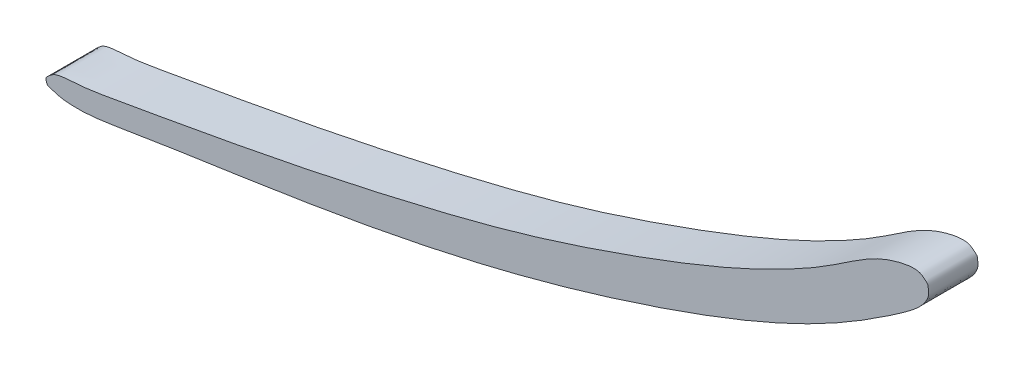
ISO-10303-21;
HEADER;
FILE_DESCRIPTION(('STEP AP214'),'2;1');
FILE_NAME('part.step','',(''),(''),'','','');
FILE_SCHEMA(('AUTOMOTIVE_DESIGN { 1 0 10303 214 1 1 1 1 }'));
ENDSEC;
DATA;
#1=APPLICATION_CONTEXT('core data for automotive mechanical design processes');
#2=APPLICATION_PROTOCOL_DEFINITION('international standard','automotive_design',2000,#1);
#3=PRODUCT_CONTEXT('',#1,'mechanical');
#4=PRODUCT('Part','Part','',(#3));
#5=PRODUCT_RELATED_PRODUCT_CATEGORY('part','',(#4));
#6=PRODUCT_DEFINITION_FORMATION('','',#4);
#7=PRODUCT_DEFINITION_CONTEXT('part definition',#1,'design');
#8=PRODUCT_DEFINITION('design','',#6,#7);
#9=PRODUCT_DEFINITION_SHAPE('','',#8);
#10=(LENGTH_UNIT() NAMED_UNIT(*) SI_UNIT(.MILLI.,.METRE.));
#11=(NAMED_UNIT(*) PLANE_ANGLE_UNIT() SI_UNIT($,.RADIAN.));
#12=(NAMED_UNIT(*) SI_UNIT($,.STERADIAN.) SOLID_ANGLE_UNIT());
#13=UNCERTAINTY_MEASURE_WITH_UNIT(LENGTH_MEASURE(1.E-05),#10,'distance_accuracy_value','');
#14=(GEOMETRIC_REPRESENTATION_CONTEXT(3) GLOBAL_UNCERTAINTY_ASSIGNED_CONTEXT((#13)) GLOBAL_UNIT_ASSIGNED_CONTEXT((#10,
#11,#12)) REPRESENTATION_CONTEXT('',''));
#15=CARTESIAN_POINT('',(0.,0.,0.));
#16=DIRECTION('',(0.,0.,1.));
#17=DIRECTION('',(1.,0.,0.));
#18=AXIS2_PLACEMENT_3D('',#15,#16,#17);
#19=CARTESIAN_POINT('',(86.4107444189341,0.,292.));
#20=CARTESIAN_POINT('',(86.3702532639553,0.0931639279632339,292.));
#21=CARTESIAN_POINT('',(86.2986742180564,0.165042757350682,292.));
#22=CARTESIAN_POINT('',(86.150263807262,0.299652843871098,292.));
#23=CARTESIAN_POINT('',(86.0721127918665,0.362289524879843,292.));
#24=CARTESIAN_POINT('',(85.8412535119041,0.554451420526711,292.));
#25=CARTESIAN_POINT('',(85.6879544774455,0.685078756353185,292.));
#26=CARTESIAN_POINT('',(85.4403423634798,0.851590056552038,292.));
#27=CARTESIAN_POINT('',(85.3553804178565,0.902725484310937,292.));
#28=CARTESIAN_POINT('',(85.1765416331934,0.98893443719411,292.));
#29=CARTESIAN_POINT('',(85.0821754288369,1.02451638831159,292.));
#30=CARTESIAN_POINT('',(84.7924109516979,1.1096489731102,292.));
#31=CARTESIAN_POINT('',(84.5954378283956,1.13700525967428,292.));
#32=CARTESIAN_POINT('',(84.1977311034757,1.16260034300273,292.));
#33=CARTESIAN_POINT('',(83.9963778476064,1.16003315475247,292.));
#34=CARTESIAN_POINT('',(83.5987657154226,1.13957823577692,292.));
#35=CARTESIAN_POINT('',(83.4013471428192,1.12138370308504,292.));
#36=CARTESIAN_POINT('',(82.812789178891,1.0455673741112,292.));
#37=CARTESIAN_POINT('',(82.425085209681,0.968219172119219,292.));
#38=CARTESIAN_POINT('',(81.2684800296784,0.698812534714772,292.));
#39=CARTESIAN_POINT('',(80.5059501899581,0.463102513101255,292.));
#40=CARTESIAN_POINT('',(79.0297396895748,-0.0848578038750889,292.));
#41=CARTESIAN_POINT('',(78.3122091962927,-0.40063135579093,292.));
#42=CARTESIAN_POINT('',(76.2194011136764,-1.469389705887,292.));
#43=CARTESIAN_POINT('',(74.8993095395057,-2.3346344447235,292.));
#44=CARTESIAN_POINT('',(72.9308206118549,-3.65554633961775,292.));
#45=CARTESIAN_POINT('',(72.2759715088938,-4.098467738459,292.));
#46=CARTESIAN_POINT('',(70.9583083420647,-4.96844312754678,292.));
#47=CARTESIAN_POINT('',(70.2962832955493,-5.39706895987371,292.));
#48=CARTESIAN_POINT('',(68.2924543116962,-6.64757810978621,292.));
#49=CARTESIAN_POINT('',(66.9330165198068,-7.43433211807032,292.));
#50=CARTESIAN_POINT('',(64.1832884281137,-8.94637726558434,292.));
#51=CARTESIAN_POINT('',(62.7932059270421,-9.67208237136404,292.));
#52=CARTESIAN_POINT('',(59.990344977923,-11.0782788187487,292.));
#53=CARTESIAN_POINT('',(58.5771396728232,-11.7579197964482,292.));
#54=CARTESIAN_POINT('',(55.7268465832102,-13.0696242353307,292.));
#55=CARTESIAN_POINT('',(54.290164534828,-13.702495984344,292.));
#56=CARTESIAN_POINT('',(49.9538051932856,-15.5486913584524,292.));
#57=CARTESIAN_POINT('',(47.0281714477081,-16.711582043735,292.));
#58=CARTESIAN_POINT('',(41.1368648194963,-18.9522599759708,292.));
#59=CARTESIAN_POINT('',(38.1739703002721,-20.0268609784272,292.));
#60=CARTESIAN_POINT('',(32.2217436946284,-22.0984764931995,292.));
#61=CARTESIAN_POINT('',(29.2334436960078,-23.0968250708102,292.));
#62=CARTESIAN_POINT('',(23.2249201854569,-24.9953964794069,292.));
#63=CARTESIAN_POINT('',(20.2025046610923,-25.8920102163012,292.));
#64=CARTESIAN_POINT('',(14.1297241561944,-27.5754543141849,292.));
#65=CARTESIAN_POINT('',(11.0792400947335,-28.3636141086769,292.));
#66=CARTESIAN_POINT('',(4.95995926084155,-29.8703378854986,292.));
#67=CARTESIAN_POINT('',(1.89200893679663,-30.5919156084504,292.));
#68=CARTESIAN_POINT('',(-7.32357334078639,-32.6994149725366,292.));
#69=CARTESIAN_POINT('',(-13.487645066907,-34.0177879855509,292.));
#70=CARTESIAN_POINT('',(-25.8563619788372,-36.4442766078583,292.));
#71=CARTESIAN_POINT('',(-32.0596265014079,-37.5616578123007,292.));
#72=CARTESIAN_POINT('',(-39.8147753669953,-38.9493711491002,292.));
#73=CARTESIAN_POINT('',(-41.3658998866885,-39.2263933247647,292.));
#74=CARTESIAN_POINT('',(-43.6937970457526,-39.6350723224386,292.));
#75=CARTESIAN_POINT('',(-44.4699855977368,-39.7700391254469,292.));
#76=CARTESIAN_POINT('',(-46.0226995065078,-40.0379802791488,292.));
#77=CARTESIAN_POINT('',(-46.7989119832862,-40.1727942478609,292.));
#78=CARTESIAN_POINT('',(-48.3533641703772,-40.4305881557898,292.));
#79=CARTESIAN_POINT('',(-49.1317526660192,-40.5509468665665,292.));
#80=CARTESIAN_POINT('',(-50.3030158950445,-40.696212451465,292.));
#81=CARTESIAN_POINT('',(-50.6940432594774,-40.7390631781832,292.));
#82=CARTESIAN_POINT('',(-51.4774549557931,-40.8122955614729,292.));
#83=CARTESIAN_POINT('',(-51.8699609720171,-40.8415590699366,292.));
#84=CARTESIAN_POINT('',(-52.6559976304479,-40.8906708770489,292.));
#85=CARTESIAN_POINT('',(-53.0494855443209,-40.9126406611681,292.));
#86=CARTESIAN_POINT('',(-53.8322100211136,-40.9873790592953,292.));
#87=CARTESIAN_POINT('',(-54.2217212253297,-41.0363307402594,292.));
#88=CARTESIAN_POINT('',(-54.7962231928123,-41.1708598179911,292.));
#89=CARTESIAN_POINT('',(-54.9870281791859,-41.227266921747,292.));
#90=CARTESIAN_POINT('',(-55.3493681625506,-41.3716643047603,292.));
#91=CARTESIAN_POINT('',(-55.5215376541844,-41.4608720694314,292.));
#92=CARTESIAN_POINT('',(-55.8455984629091,-41.6776091311992,292.));
#93=CARTESIAN_POINT('',(-55.9995655864539,-41.8026921773461,292.));
#94=CARTESIAN_POINT('',(-56.2202295690443,-42.0006102359653,292.));
#95=CARTESIAN_POINT('',(-56.2938304579014,-42.0667713536032,292.));
#96=CARTESIAN_POINT('',(-56.4359399266764,-42.2035535503382,292.));
#97=CARTESIAN_POINT('',(-56.5057204161146,-42.2730574313685,292.));
#98=CARTESIAN_POINT('',(-56.586954790011,-42.3977799421487,292.));
#99=CARTESIAN_POINT('',(-56.6094490137321,-42.4438907890319,292.));
#100=CARTESIAN_POINT('',(-56.635227269451,-42.5401279686211,292.));
#101=CARTESIAN_POINT('',(-56.6395803649666,-42.5911574410146,292.));
#102=CARTESIAN_POINT('',(-56.63575192864,-42.7407029572521,292.));
#103=CARTESIAN_POINT('',(-56.612469661033,-42.8395328748982,292.));
#104=CARTESIAN_POINT('',(-56.5593281773153,-43.0318155736835,292.));
#105=CARTESIAN_POINT('',(-56.5289648863514,-43.1267151747893,292.));
#106=CARTESIAN_POINT('',(-56.4627148204797,-43.2622853474174,292.));
#107=CARTESIAN_POINT('',(-56.4365990727626,-43.3058314843502,292.));
#108=CARTESIAN_POINT('',(-56.3729311797595,-43.3831559858466,292.));
#109=CARTESIAN_POINT('',(-56.3349447944782,-43.4178529450406,292.));
#110=CARTESIAN_POINT('',(-56.2097090124595,-43.4999266668938,292.));
#111=CARTESIAN_POINT('',(-56.110214515792,-43.5275003781271,292.));
#112=CARTESIAN_POINT('',(-55.9153865290601,-43.5771913070677,292.));
#113=CARTESIAN_POINT('',(-55.8176885576536,-43.6010302412377,292.));
#114=CARTESIAN_POINT('',(-55.5269567386336,-43.6809192417738,292.));
#115=CARTESIAN_POINT('',(-55.3353312570157,-43.7424806460408,292.));
#116=CARTESIAN_POINT('',(-54.9509949913189,-43.8620994098829,292.));
#117=CARTESIAN_POINT('',(-54.7582413233292,-43.9188855085011,292.));
#118=CARTESIAN_POINT('',(-54.3688909351758,-44.0126149419963,292.));
#119=CARTESIAN_POINT('',(-54.1724938761363,-44.0505891836464,292.));
#120=CARTESIAN_POINT('',(-53.5798986977005,-44.146936088428,292.));
#121=CARTESIAN_POINT('',(-53.1800032447165,-44.1865656476914,292.));
#122=CARTESIAN_POINT('',(-51.9736835953004,-44.2691044311154,292.));
#123=CARTESIAN_POINT('',(-51.171770711006,-44.2668073136291,292.));
#124=CARTESIAN_POINT('',(-49.5712906902499,-44.1788347046207,292.));
#125=CARTESIAN_POINT('',(-48.772290681742,-44.0952298089752,292.));
#126=CARTESIAN_POINT('',(-47.1771303077654,-43.8961763260337,292.));
#127=CARTESIAN_POINT('',(-46.3818998036307,-43.7792310717353,292.));
#128=CARTESIAN_POINT('',(-44.7931829368681,-43.5340383462042,292.));
#129=CARTESIAN_POINT('',(-43.9996613907252,-43.4061836625423,292.));
#130=CARTESIAN_POINT('',(-41.6195852592183,-43.0195502301193,292.));
#131=CARTESIAN_POINT('',(-40.0329566510122,-42.7612365808829,292.));
#132=CARTESIAN_POINT('',(-35.2686378484196,-42.0141488727108,292.));
#133=CARTESIAN_POINT('',(-32.0875060248464,-41.5481047975922,292.));
#134=CARTESIAN_POINT('',(-25.7256528473695,-40.6141482356322,292.));
#135=CARTESIAN_POINT('',(-22.5449398745817,-40.1457845403477,292.));
#136=CARTESIAN_POINT('',(-13.0132014796091,-38.6739466261302,292.));
#137=CARTESIAN_POINT('',(-6.67177366310591,-37.6013258759664,292.));
#138=CARTESIAN_POINT('',(2.79507521139751,-35.7629798300183,292.));
#139=CARTESIAN_POINT('',(5.94406469069156,-35.1123898378093,292.));
#140=CARTESIAN_POINT('',(12.2227754789635,-33.7261697545921,292.));
#141=CARTESIAN_POINT('',(15.3519741121725,-32.9913442173967,292.));
#142=CARTESIAN_POINT('',(24.7027981395963,-30.6358394499247,292.));
#143=CARTESIAN_POINT('',(30.8883243258608,-28.8675091985814,292.));
#144=CARTESIAN_POINT('',(40.0765439679939,-25.9396719989839,292.));
#145=CARTESIAN_POINT('',(43.1266871304444,-24.91943867694,292.));
#146=CARTESIAN_POINT('',(49.1888257332316,-22.7795792235543,292.));
#147=CARTESIAN_POINT('',(52.2017339004957,-21.6606572944945,292.));
#148=CARTESIAN_POINT('',(58.1751824532794,-19.2815440122042,292.));
#149=CARTESIAN_POINT('',(61.1347189920993,-18.0202823701102,292.));
#150=CARTESIAN_POINT('',(66.9529022072111,-15.287010876409,292.));
#151=CARTESIAN_POINT('',(69.8133060857934,-13.8096371790513,292.));
#152=CARTESIAN_POINT('',(75.390864884769,-10.6085314312731,292.));
#153=CARTESIAN_POINT('',(78.1110592362288,-8.88591947899353,292.));
#154=CARTESIAN_POINT('',(81.4297027961348,-6.6158699950117,292.));
#155=CARTESIAN_POINT('',(82.0897915995956,-6.1561083942127,292.));
#156=CARTESIAN_POINT('',(83.0648845631149,-5.44626674858139,292.));
#157=CARTESIAN_POINT('',(83.3867754658633,-5.20543845534977,292.));
#158=CARTESIAN_POINT('',(84.0194036811324,-4.70881226904128,292.));
#159=CARTESIAN_POINT('',(84.3307645237014,-4.45382524607169,292.));
#160=CARTESIAN_POINT('',(84.9273604117586,-3.91873217393002,292.));
#161=CARTESIAN_POINT('',(85.2128554915371,-3.6382683254879,292.));
#162=CARTESIAN_POINT('',(85.7395551437795,-3.03265419696669,292.));
#163=CARTESIAN_POINT('',(85.980484547917,-2.70339798275978,292.));
#164=CARTESIAN_POINT('',(86.2715461910316,-2.1754726599166,292.));
#165=CARTESIAN_POINT('',(86.3582571295032,-1.99332703094194,292.));
#166=CARTESIAN_POINT('',(86.493223987058,-1.60967796356801,292.));
#167=CARTESIAN_POINT('',(86.5403948740077,-1.4139000872235,292.));
#168=CARTESIAN_POINT('',(86.5607026948125,-1.00793542464248,292.));
#169=CARTESIAN_POINT('',(86.5283160815541,-0.804135017034041,292.));
#170=CARTESIAN_POINT('',(86.4845290700614,-0.501448802039711,292.));
#171=CARTESIAN_POINT('',(86.4742665986386,-0.400107023332174,292.));
#172=CARTESIAN_POINT('',(86.4564845928508,-0.197140909088372,292.));
#173=CARTESIAN_POINT('',(86.4512355739129,-0.093163927963233,292.));
#174=CARTESIAN_POINT('',(86.4107444189341,0.,292.));
#175=B_SPLINE_CURVE_WITH_KNOTS('',3,(#19,#20,#21,#22,#23,#24,#25,#26,#27,#28,#29,#30,#31,#32,
#33,#34,#35,#36,#37,#38,#39,#40,#41,#42,#43,#44,#45,#46,#47,#48,#49,#50,#51,#52,#53,#54,#55,#56,
#57,#58,#59,#60,#61,#62,#63,#64,#65,#66,#67,#68,#69,#70,#71,#72,#73,#74,#75,#76,#77,#78,#79,#80,
#81,#82,#83,#84,#85,#86,#87,#88,#89,#90,#91,#92,#93,#94,#95,#96,#97,#98,#99,#100,#101,#102,#103,
#104,#105,#106,#107,#108,#109,#110,#111,#112,#113,#114,#115,#116,#117,#118,#119,#120,#121,#122,
#123,#124,#125,#126,#127,#128,#129,#130,#131,#132,#133,#134,#135,#136,#137,#138,#139,#140,#141,
#142,#143,#144,#145,#146,#147,#148,#149,#150,#151,#152,#153,#154,#155,#156,#157,#158,#159,#160,
#161,#162,#163,#164,#165,#166,#167,#168,#169,#170,#171,#172,#173,#174),.UNSPECIFIED.,.T.,.F.,(4,
2,2,2,2,2,2,2,2,2,2,2,2,2,2,2,2,2,2,2,2,2,2,2,2,2,2,2,2,2,2,2,2,2,2,2,2,2,2,2,2,2,2,2,2,2,2,2,2,
2,2,2,2,2,2,2,2,2,2,2,2,2,2,2,2,2,2,2,2,2,2,2,2,2,2,2,2,4),(0.,0.000976562499999972,
0.00195312499999994,0.00390624999999999,0.00488281250000001,0.00585937500000004,
0.00781250000000021,0.00976562500000039,0.0117187500000006,0.0156250000000009,
0.0234375000000016,0.0312500000000023,0.0468750000000037,0.0546875000000044,0.062500000000005,
0.0781250000000062,0.0937500000000074,0.109375000000009,0.12500000000001,0.156250000000012,
0.187500000000014,0.218750000000016,0.250000000000019,0.281250000000021,0.312500000000023,
0.375000000000028,0.437500000000032,0.453125000000033,0.460937500000034,0.468750000000035,
0.476562500000035,0.480468750000035,0.484375000000036,0.488281250000036,0.492187500000036,
0.494140625000036,0.496093750000037,0.498046875000037,0.499023437500037,0.500000000000037,
0.500488281250037,0.500976562500037,0.501953125000037,0.502929687500037,0.503417968750037,
0.503906250000037,0.504882812500037,0.505859375000037,0.507812500000036,0.509765625000036,
0.511718750000036,0.515625000000036,0.523437500000035,0.531250000000035,0.539062500000034,
0.546875000000034,0.562500000000032,0.59375000000003,0.625000000000028,0.687500000000023,
0.718750000000021,0.750000000000019,0.812500000000014,0.843750000000012,0.87500000000001,
0.906250000000007,0.937500000000005,0.968750000000003,0.976562500000002,0.980468750000002,
0.984375000000001,0.988281250000001,0.992187500000001,0.994140625000001,0.99609375,0.998046875,
0.9990234375,1.),.UNSPECIFIED.);
#176=DIRECTION('',(0.,0.,-1.));
#177=VECTOR('',#176,1.);
#178=SURFACE_OF_LINEAR_EXTRUSION('',#175,#177);
#179=CARTESIAN_POINT('',(86.4107444189341,0.,292.));
#180=CARTESIAN_POINT('',(86.4512355739129,-0.093163927963233,292.));
#181=CARTESIAN_POINT('',(86.4564845928508,-0.197140909088372,292.));
#182=CARTESIAN_POINT('',(86.4742665986386,-0.400107023332174,292.));
#183=CARTESIAN_POINT('',(86.4845290700614,-0.501448802039711,292.));
#184=CARTESIAN_POINT('',(86.5283160815541,-0.804135017034041,292.));
#185=CARTESIAN_POINT('',(86.5607026948125,-1.00793542464248,292.));
#186=CARTESIAN_POINT('',(86.5403948740077,-1.4139000872235,292.));
#187=CARTESIAN_POINT('',(86.493223987058,-1.60967796356801,292.));
#188=CARTESIAN_POINT('',(86.3582571295032,-1.99332703094194,292.));
#189=CARTESIAN_POINT('',(86.2715461910316,-2.1754726599166,292.));
#190=CARTESIAN_POINT('',(85.980484547917,-2.70339798275978,292.));
#191=CARTESIAN_POINT('',(85.7395551437795,-3.03265419696669,292.));
#192=CARTESIAN_POINT('',(85.2128554915371,-3.6382683254879,292.));
#193=CARTESIAN_POINT('',(84.9273604117586,-3.91873217393002,292.));
#194=CARTESIAN_POINT('',(84.3307645237014,-4.45382524607169,292.));
#195=CARTESIAN_POINT('',(84.0194036811324,-4.70881226904128,292.));
#196=CARTESIAN_POINT('',(83.3867754658633,-5.20543845534977,292.));
#197=CARTESIAN_POINT('',(83.0648845631149,-5.44626674858139,292.));
#198=CARTESIAN_POINT('',(82.0897915995956,-6.1561083942127,292.));
#199=CARTESIAN_POINT('',(81.4297027961348,-6.6158699950117,292.));
#200=CARTESIAN_POINT('',(78.1110592362288,-8.88591947899353,292.));
#201=CARTESIAN_POINT('',(75.390864884769,-10.6085314312731,292.));
#202=CARTESIAN_POINT('',(69.8133060857934,-13.8096371790513,292.));
#203=CARTESIAN_POINT('',(66.9529022072111,-15.287010876409,292.));
#204=CARTESIAN_POINT('',(61.1347189920993,-18.0202823701102,292.));
#205=CARTESIAN_POINT('',(58.1751824532794,-19.2815440122042,292.));
#206=CARTESIAN_POINT('',(52.2017339004957,-21.6606572944945,292.));
#207=CARTESIAN_POINT('',(49.1888257332316,-22.7795792235543,292.));
#208=CARTESIAN_POINT('',(43.1266871304444,-24.91943867694,292.));
#209=CARTESIAN_POINT('',(40.0765439679939,-25.9396719989839,292.));
#210=CARTESIAN_POINT('',(30.8883243258608,-28.8675091985814,292.));
#211=CARTESIAN_POINT('',(24.7027981395963,-30.6358394499247,292.));
#212=CARTESIAN_POINT('',(15.3519741121725,-32.9913442173967,292.));
#213=CARTESIAN_POINT('',(12.2227754789635,-33.7261697545921,292.));
#214=CARTESIAN_POINT('',(5.94406469069156,-35.1123898378093,292.));
#215=CARTESIAN_POINT('',(2.79507521139751,-35.7629798300183,292.));
#216=CARTESIAN_POINT('',(-6.67177366310591,-37.6013258759664,292.));
#217=CARTESIAN_POINT('',(-13.0132014796091,-38.6739466261302,292.));
#218=CARTESIAN_POINT('',(-22.5449398745817,-40.1457845403477,292.));
#219=CARTESIAN_POINT('',(-25.7256528473695,-40.6141482356322,292.));
#220=CARTESIAN_POINT('',(-32.0875060248464,-41.5481047975922,292.));
#221=CARTESIAN_POINT('',(-35.2686378484196,-42.0141488727108,292.));
#222=CARTESIAN_POINT('',(-40.0329566510122,-42.7612365808829,292.));
#223=CARTESIAN_POINT('',(-41.6195852592183,-43.0195502301193,292.));
#224=CARTESIAN_POINT('',(-43.9996613907252,-43.4061836625423,292.));
#225=CARTESIAN_POINT('',(-44.7931829368681,-43.5340383462042,292.));
#226=CARTESIAN_POINT('',(-46.3818998036307,-43.7792310717353,292.));
#227=CARTESIAN_POINT('',(-47.1771303077654,-43.8961763260337,292.));
#228=CARTESIAN_POINT('',(-48.772290681742,-44.0952298089752,292.));
#229=CARTESIAN_POINT('',(-49.5712906902499,-44.1788347046207,292.));
#230=CARTESIAN_POINT('',(-51.171770711006,-44.2668073136291,292.));
#231=CARTESIAN_POINT('',(-51.9736835953004,-44.2691044311154,292.));
#232=CARTESIAN_POINT('',(-53.1800032447165,-44.1865656476914,292.));
#233=CARTESIAN_POINT('',(-53.5798986977005,-44.146936088428,292.));
#234=CARTESIAN_POINT('',(-54.1724938761363,-44.0505891836464,292.));
#235=CARTESIAN_POINT('',(-54.3688909351758,-44.0126149419963,292.));
#236=CARTESIAN_POINT('',(-54.7582413233292,-43.9188855085011,292.));
#237=CARTESIAN_POINT('',(-54.9509949913189,-43.8620994098829,292.));
#238=CARTESIAN_POINT('',(-55.3353312570157,-43.7424806460408,292.));
#239=CARTESIAN_POINT('',(-55.5269567386336,-43.6809192417738,292.));
#240=CARTESIAN_POINT('',(-55.8176885576536,-43.6010302412377,292.));
#241=CARTESIAN_POINT('',(-55.9153865290601,-43.5771913070677,292.));
#242=CARTESIAN_POINT('',(-56.110214515792,-43.5275003781271,292.));
#243=CARTESIAN_POINT('',(-56.2097090124595,-43.4999266668938,292.));
#244=CARTESIAN_POINT('',(-56.3349447944782,-43.4178529450406,292.));
#245=CARTESIAN_POINT('',(-56.3729311797595,-43.3831559858466,292.));
#246=CARTESIAN_POINT('',(-56.4365990727626,-43.3058314843502,292.));
#247=CARTESIAN_POINT('',(-56.4627148204797,-43.2622853474174,292.));
#248=CARTESIAN_POINT('',(-56.5289648863514,-43.1267151747893,292.));
#249=CARTESIAN_POINT('',(-56.5593281773153,-43.0318155736835,292.));
#250=CARTESIAN_POINT('',(-56.612469661033,-42.8395328748982,292.));
#251=CARTESIAN_POINT('',(-56.63575192864,-42.7407029572521,292.));
#252=CARTESIAN_POINT('',(-56.6395803649666,-42.5911574410146,292.));
#253=CARTESIAN_POINT('',(-56.635227269451,-42.5401279686211,292.));
#254=CARTESIAN_POINT('',(-56.6094490137321,-42.4438907890319,292.));
#255=CARTESIAN_POINT('',(-56.586954790011,-42.3977799421487,292.));
#256=CARTESIAN_POINT('',(-56.5057204161146,-42.2730574313685,292.));
#257=CARTESIAN_POINT('',(-56.4359399266764,-42.2035535503382,292.));
#258=CARTESIAN_POINT('',(-56.2938304579014,-42.0667713536032,292.));
#259=CARTESIAN_POINT('',(-56.2202295690443,-42.0006102359653,292.));
#260=CARTESIAN_POINT('',(-55.9995655864539,-41.8026921773461,292.));
#261=CARTESIAN_POINT('',(-55.8455984629091,-41.6776091311992,292.));
#262=CARTESIAN_POINT('',(-55.5215376541844,-41.4608720694314,292.));
#263=CARTESIAN_POINT('',(-55.3493681625506,-41.3716643047603,292.));
#264=CARTESIAN_POINT('',(-54.9870281791859,-41.227266921747,292.));
#265=CARTESIAN_POINT('',(-54.7962231928123,-41.1708598179911,292.));
#266=CARTESIAN_POINT('',(-54.2217212253297,-41.0363307402594,292.));
#267=CARTESIAN_POINT('',(-53.8322100211136,-40.9873790592953,292.));
#268=CARTESIAN_POINT('',(-53.0494855443209,-40.9126406611681,292.));
#269=CARTESIAN_POINT('',(-52.6559976304479,-40.8906708770489,292.));
#270=CARTESIAN_POINT('',(-51.8699609720171,-40.8415590699366,292.));
#271=CARTESIAN_POINT('',(-51.4774549557931,-40.8122955614729,292.));
#272=CARTESIAN_POINT('',(-50.6940432594774,-40.7390631781832,292.));
#273=CARTESIAN_POINT('',(-50.3030158950445,-40.696212451465,292.));
#274=CARTESIAN_POINT('',(-49.1317526660192,-40.5509468665665,292.));
#275=CARTESIAN_POINT('',(-48.3533641703772,-40.4305881557898,292.));
#276=CARTESIAN_POINT('',(-46.7989119832862,-40.1727942478609,292.));
#277=CARTESIAN_POINT('',(-46.0226995065078,-40.0379802791488,292.));
#278=CARTESIAN_POINT('',(-44.4699855977368,-39.7700391254469,292.));
#279=CARTESIAN_POINT('',(-43.6937970457526,-39.6350723224386,292.));
#280=CARTESIAN_POINT('',(-41.3658998866885,-39.2263933247647,292.));
#281=CARTESIAN_POINT('',(-39.8147753669953,-38.9493711491002,292.));
#282=CARTESIAN_POINT('',(-32.0596265014079,-37.5616578123007,292.));
#283=CARTESIAN_POINT('',(-25.8563619788372,-36.4442766078583,292.));
#284=CARTESIAN_POINT('',(-13.487645066907,-34.0177879855509,292.));
#285=CARTESIAN_POINT('',(-7.32357334078639,-32.6994149725366,292.));
#286=CARTESIAN_POINT('',(1.89200893679663,-30.5919156084504,292.));
#287=CARTESIAN_POINT('',(4.95995926084155,-29.8703378854986,292.));
#288=CARTESIAN_POINT('',(11.0792400947335,-28.3636141086769,292.));
#289=CARTESIAN_POINT('',(14.1297241561944,-27.5754543141849,292.));
#290=CARTESIAN_POINT('',(20.2025046610923,-25.8920102163012,292.));
#291=CARTESIAN_POINT('',(23.2249201854569,-24.9953964794069,292.));
#292=CARTESIAN_POINT('',(29.2334436960078,-23.0968250708102,292.));
#293=CARTESIAN_POINT('',(32.2217436946284,-22.0984764931995,292.));
#294=CARTESIAN_POINT('',(38.1739703002721,-20.0268609784272,292.));
#295=CARTESIAN_POINT('',(41.1368648194963,-18.9522599759708,292.));
#296=CARTESIAN_POINT('',(47.0281714477081,-16.711582043735,292.));
#297=CARTESIAN_POINT('',(49.9538051932856,-15.5486913584524,292.));
#298=CARTESIAN_POINT('',(54.290164534828,-13.702495984344,292.));
#299=CARTESIAN_POINT('',(55.7268465832102,-13.0696242353307,292.));
#300=CARTESIAN_POINT('',(58.5771396728232,-11.7579197964482,292.));
#301=CARTESIAN_POINT('',(59.990344977923,-11.0782788187487,292.));
#302=CARTESIAN_POINT('',(62.7932059270421,-9.67208237136404,292.));
#303=CARTESIAN_POINT('',(64.1832884281137,-8.94637726558434,292.));
#304=CARTESIAN_POINT('',(66.9330165198068,-7.43433211807032,292.));
#305=CARTESIAN_POINT('',(68.2924543116962,-6.64757810978621,292.));
#306=CARTESIAN_POINT('',(70.2962832955493,-5.39706895987371,292.));
#307=CARTESIAN_POINT('',(70.9583083420647,-4.96844312754678,292.));
#308=CARTESIAN_POINT('',(72.2759715088938,-4.098467738459,292.));
#309=CARTESIAN_POINT('',(72.9308206118549,-3.65554633961775,292.));
#310=CARTESIAN_POINT('',(74.8993095395057,-2.3346344447235,292.));
#311=CARTESIAN_POINT('',(76.2194011136764,-1.469389705887,292.));
#312=CARTESIAN_POINT('',(78.3122091962927,-0.40063135579093,292.));
#313=CARTESIAN_POINT('',(79.0297396895748,-0.0848578038750889,292.));
#314=CARTESIAN_POINT('',(80.5059501899581,0.463102513101255,292.));
#315=CARTESIAN_POINT('',(81.2684800296784,0.698812534714772,292.));
#316=CARTESIAN_POINT('',(82.425085209681,0.968219172119219,292.));
#317=CARTESIAN_POINT('',(82.812789178891,1.0455673741112,292.));
#318=CARTESIAN_POINT('',(83.4013471428192,1.12138370308504,292.));
#319=CARTESIAN_POINT('',(83.5987657154226,1.13957823577692,292.));
#320=CARTESIAN_POINT('',(83.9963778476064,1.16003315475247,292.));
#321=CARTESIAN_POINT('',(84.1977311034757,1.16260034300273,292.));
#322=CARTESIAN_POINT('',(84.5954378283956,1.13700525967428,292.));
#323=CARTESIAN_POINT('',(84.7924109516979,1.1096489731102,292.));
#324=CARTESIAN_POINT('',(85.0821754288369,1.02451638831159,292.));
#325=CARTESIAN_POINT('',(85.1765416331934,0.98893443719411,292.));
#326=CARTESIAN_POINT('',(85.3553804178565,0.902725484310937,292.));
#327=CARTESIAN_POINT('',(85.4403423634798,0.851590056552038,292.));
#328=CARTESIAN_POINT('',(85.6879544774455,0.685078756353185,292.));
#329=CARTESIAN_POINT('',(85.8412535119041,0.554451420526711,292.));
#330=CARTESIAN_POINT('',(86.0721127918665,0.362289524879843,292.));
#331=CARTESIAN_POINT('',(86.150263807262,0.299652843871098,292.));
#332=CARTESIAN_POINT('',(86.2986742180564,0.165042757350682,292.));
#333=CARTESIAN_POINT('',(86.3702532639553,0.0931639279632339,292.));
#334=CARTESIAN_POINT('',(86.4107444189341,0.,292.));
#335=B_SPLINE_CURVE_WITH_KNOTS('',3,(#179,#180,#181,#182,#183,#184,#185,#186,#187,#188,#189,
#190,#191,#192,#193,#194,#195,#196,#197,#198,#199,#200,#201,#202,#203,#204,#205,#206,#207,#208,
#209,#210,#211,#212,#213,#214,#215,#216,#217,#218,#219,#220,#221,#222,#223,#224,#225,#226,#227,
#228,#229,#230,#231,#232,#233,#234,#235,#236,#237,#238,#239,#240,#241,#242,#243,#244,#245,#246,
#247,#248,#249,#250,#251,#252,#253,#254,#255,#256,#257,#258,#259,#260,#261,#262,#263,#264,#265,
#266,#267,#268,#269,#270,#271,#272,#273,#274,#275,#276,#277,#278,#279,#280,#281,#282,#283,#284,
#285,#286,#287,#288,#289,#290,#291,#292,#293,#294,#295,#296,#297,#298,#299,#300,#301,#302,#303,
#304,#305,#306,#307,#308,#309,#310,#311,#312,#313,#314,#315,#316,#317,#318,#319,#320,#321,#322,
#323,#324,#325,#326,#327,#328,#329,#330,#331,#332,#333,#334),.UNSPECIFIED.,.T.,.F.,(4,2,2,2,2,2,
2,2,2,2,2,2,2,2,2,2,2,2,2,2,2,2,2,2,2,2,2,2,2,2,2,2,2,2,2,2,2,2,2,2,2,2,2,2,2,2,2,2,2,2,2,2,2,2,
2,2,2,2,2,2,2,2,2,2,2,2,2,2,2,2,2,2,2,2,2,2,2,4),(0.,0.000976562499999889,0.00195312499999978,
0.00390624999999967,0.00585937499999944,0.00781249999999933,0.011718749999999,
0.0156249999999987,0.0195312499999983,0.023437499999998,0.0312499999999973,0.062499999999995,
0.0937499999999926,0.12499999999999,0.156249999999988,0.187499999999986,0.249999999999981,
0.281249999999979,0.312499999999977,0.374999999999972,0.40624999999997,0.437499999999968,
0.453124999999966,0.460937499999966,0.468749999999965,0.476562499999965,0.484374999999964,
0.488281249999964,0.490234374999964,0.492187499999964,0.494140624999963,0.495117187499963,
0.496093749999963,0.496582031249963,0.497070312499963,0.498046874999963,0.499023437499963,
0.499511718749963,0.499999999999963,0.500976562499963,0.501953124999963,0.503906249999963,
0.505859374999964,0.507812499999964,0.511718749999964,0.515624999999964,0.519531249999964,
0.523437499999965,0.531249999999965,0.539062499999966,0.546874999999967,0.562499999999968,
0.624999999999972,0.687499999999977,0.718749999999979,0.749999999999981,0.781249999999984,
0.812499999999986,0.843749999999988,0.87499999999999,0.890624999999991,0.906249999999993,
0.921874999999994,0.937499999999995,0.945312499999996,0.953124999999996,0.968749999999998,
0.976562499999998,0.984374999999999,0.988281249999999,0.990234375,0.9921875,0.994140625,
0.9951171875,0.99609375,0.998046875,0.9990234375,1.),.UNSPECIFIED.);
#336=CARTESIAN_POINT('',(86.4107444189341,0.,292.));
#337=VERTEX_POINT('',#336);
#338=EDGE_CURVE('E10',#337,#337,#335,.F.);
#339=ORIENTED_EDGE('',*,*,#338,.F.);
#340=EDGE_LOOP('',(#339));
#341=FACE_BOUND('',#340,.T.);
#342=CARTESIAN_POINT('',(86.4107444189341,0.,283.999999999999));
#343=CARTESIAN_POINT('',(86.3702532639553,0.0931639279632339,283.999999999999));
#344=CARTESIAN_POINT('',(86.2986742180564,0.165042757350682,283.999999999999));
#345=CARTESIAN_POINT('',(86.150263807262,0.299652843871098,283.999999999999));
#346=CARTESIAN_POINT('',(86.0721127918665,0.362289524879843,283.999999999999));
#347=CARTESIAN_POINT('',(85.8412535119041,0.554451420526711,283.999999999999));
#348=CARTESIAN_POINT('',(85.6879544774455,0.685078756353185,283.999999999999));
#349=CARTESIAN_POINT('',(85.4403423634798,0.851590056552038,283.999999999999));
#350=CARTESIAN_POINT('',(85.3553804178565,0.902725484310937,283.999999999999));
#351=CARTESIAN_POINT('',(85.1765416331934,0.98893443719411,283.999999999999));
#352=CARTESIAN_POINT('',(85.0821754288369,1.02451638831159,283.999999999999));
#353=CARTESIAN_POINT('',(84.7924109516979,1.1096489731102,283.999999999999));
#354=CARTESIAN_POINT('',(84.5954378283956,1.13700525967428,283.999999999999));
#355=CARTESIAN_POINT('',(84.1977311034757,1.16260034300273,283.999999999999));
#356=CARTESIAN_POINT('',(83.9963778476064,1.16003315475247,283.999999999999));
#357=CARTESIAN_POINT('',(83.5987657154226,1.13957823577692,283.999999999999));
#358=CARTESIAN_POINT('',(83.4013471428192,1.12138370308504,283.999999999999));
#359=CARTESIAN_POINT('',(82.812789178891,1.0455673741112,283.999999999999));
#360=CARTESIAN_POINT('',(82.425085209681,0.968219172119219,283.999999999999));
#361=CARTESIAN_POINT('',(81.2684800296784,0.698812534714772,283.999999999999));
#362=CARTESIAN_POINT('',(80.5059501899581,0.463102513101255,283.999999999999));
#363=CARTESIAN_POINT('',(79.0297396895748,-0.0848578038750889,283.999999999999));
#364=CARTESIAN_POINT('',(78.3122091962927,-0.40063135579093,283.999999999999));
#365=CARTESIAN_POINT('',(76.2194011136764,-1.469389705887,283.999999999999));
#366=CARTESIAN_POINT('',(74.8993095395057,-2.3346344447235,283.999999999999));
#367=CARTESIAN_POINT('',(72.9308206118549,-3.65554633961775,283.999999999999));
#368=CARTESIAN_POINT('',(72.2759715088938,-4.098467738459,283.999999999999));
#369=CARTESIAN_POINT('',(70.9583083420647,-4.96844312754678,283.999999999999));
#370=CARTESIAN_POINT('',(70.2962832955493,-5.39706895987371,283.999999999999));
#371=CARTESIAN_POINT('',(68.2924543116962,-6.64757810978621,283.999999999999));
#372=CARTESIAN_POINT('',(66.9330165198068,-7.43433211807032,283.999999999999));
#373=CARTESIAN_POINT('',(64.1832884281137,-8.94637726558434,283.999999999999));
#374=CARTESIAN_POINT('',(62.7932059270421,-9.67208237136404,283.999999999999));
#375=CARTESIAN_POINT('',(59.990344977923,-11.0782788187487,283.999999999999));
#376=CARTESIAN_POINT('',(58.5771396728232,-11.7579197964482,283.999999999999));
#377=CARTESIAN_POINT('',(55.7268465832102,-13.0696242353307,283.999999999999));
#378=CARTESIAN_POINT('',(54.290164534828,-13.702495984344,283.999999999999));
#379=CARTESIAN_POINT('',(49.9538051932856,-15.5486913584524,283.999999999999));
#380=CARTESIAN_POINT('',(47.0281714477081,-16.711582043735,283.999999999999));
#381=CARTESIAN_POINT('',(41.1368648194963,-18.9522599759708,283.999999999999));
#382=CARTESIAN_POINT('',(38.1739703002721,-20.0268609784272,283.999999999999));
#383=CARTESIAN_POINT('',(32.2217436946284,-22.0984764931995,283.999999999999));
#384=CARTESIAN_POINT('',(29.2334436960078,-23.0968250708102,283.999999999999));
#385=CARTESIAN_POINT('',(23.2249201854569,-24.9953964794069,283.999999999999));
#386=CARTESIAN_POINT('',(20.2025046610923,-25.8920102163012,283.999999999999));
#387=CARTESIAN_POINT('',(14.1297241561944,-27.5754543141849,283.999999999999));
#388=CARTESIAN_POINT('',(11.0792400947335,-28.3636141086769,283.999999999999));
#389=CARTESIAN_POINT('',(4.95995926084155,-29.8703378854986,283.999999999999));
#390=CARTESIAN_POINT('',(1.89200893679663,-30.5919156084504,283.999999999999));
#391=CARTESIAN_POINT('',(-7.32357334078639,-32.6994149725366,283.999999999999));
#392=CARTESIAN_POINT('',(-13.487645066907,-34.0177879855509,283.999999999999));
#393=CARTESIAN_POINT('',(-25.8563619788372,-36.4442766078583,283.999999999999));
#394=CARTESIAN_POINT('',(-32.0596265014079,-37.5616578123007,283.999999999999));
#395=CARTESIAN_POINT('',(-39.8147753669953,-38.9493711491002,283.999999999999));
#396=CARTESIAN_POINT('',(-41.3658998866885,-39.2263933247647,283.999999999999));
#397=CARTESIAN_POINT('',(-43.6937970457526,-39.6350723224386,283.999999999999));
#398=CARTESIAN_POINT('',(-44.4699855977368,-39.7700391254469,283.999999999999));
#399=CARTESIAN_POINT('',(-46.0226995065078,-40.0379802791488,283.999999999999));
#400=CARTESIAN_POINT('',(-46.7989119832862,-40.1727942478609,283.999999999999));
#401=CARTESIAN_POINT('',(-48.3533641703772,-40.4305881557898,283.999999999999));
#402=CARTESIAN_POINT('',(-49.1317526660192,-40.5509468665665,283.999999999999));
#403=CARTESIAN_POINT('',(-50.3030158950445,-40.696212451465,283.999999999999));
#404=CARTESIAN_POINT('',(-50.6940432594774,-40.7390631781832,283.999999999999));
#405=CARTESIAN_POINT('',(-51.4774549557931,-40.8122955614729,283.999999999999));
#406=CARTESIAN_POINT('',(-51.8699609720171,-40.8415590699366,283.999999999999));
#407=CARTESIAN_POINT('',(-52.6559976304479,-40.8906708770489,283.999999999999));
#408=CARTESIAN_POINT('',(-53.0494855443209,-40.9126406611681,283.999999999999));
#409=CARTESIAN_POINT('',(-53.8322100211136,-40.9873790592953,283.999999999999));
#410=CARTESIAN_POINT('',(-54.2217212253297,-41.0363307402594,283.999999999999));
#411=CARTESIAN_POINT('',(-54.7962231928123,-41.1708598179911,283.999999999999));
#412=CARTESIAN_POINT('',(-54.9870281791859,-41.227266921747,283.999999999999));
#413=CARTESIAN_POINT('',(-55.3493681625506,-41.3716643047603,283.999999999999));
#414=CARTESIAN_POINT('',(-55.5215376541844,-41.4608720694314,283.999999999999));
#415=CARTESIAN_POINT('',(-55.8455984629091,-41.6776091311992,283.999999999999));
#416=CARTESIAN_POINT('',(-55.9995655864539,-41.8026921773461,283.999999999999));
#417=CARTESIAN_POINT('',(-56.2202295690443,-42.0006102359653,283.999999999999));
#418=CARTESIAN_POINT('',(-56.2938304579014,-42.0667713536032,283.999999999999));
#419=CARTESIAN_POINT('',(-56.4359399266764,-42.2035535503382,283.999999999999));
#420=CARTESIAN_POINT('',(-56.5057204161146,-42.2730574313685,283.999999999999));
#421=CARTESIAN_POINT('',(-56.586954790011,-42.3977799421487,283.999999999999));
#422=CARTESIAN_POINT('',(-56.6094490137321,-42.4438907890319,283.999999999999));
#423=CARTESIAN_POINT('',(-56.635227269451,-42.5401279686211,283.999999999999));
#424=CARTESIAN_POINT('',(-56.6395803649666,-42.5911574410146,283.999999999999));
#425=CARTESIAN_POINT('',(-56.63575192864,-42.7407029572521,283.999999999999));
#426=CARTESIAN_POINT('',(-56.612469661033,-42.8395328748982,283.999999999999));
#427=CARTESIAN_POINT('',(-56.5593281773153,-43.0318155736835,283.999999999999));
#428=CARTESIAN_POINT('',(-56.5289648863514,-43.1267151747893,283.999999999999));
#429=CARTESIAN_POINT('',(-56.4627148204797,-43.2622853474174,283.999999999999));
#430=CARTESIAN_POINT('',(-56.4365990727626,-43.3058314843502,283.999999999999));
#431=CARTESIAN_POINT('',(-56.3729311797595,-43.3831559858466,283.999999999999));
#432=CARTESIAN_POINT('',(-56.3349447944782,-43.4178529450406,283.999999999999));
#433=CARTESIAN_POINT('',(-56.2097090124595,-43.4999266668938,283.999999999999));
#434=CARTESIAN_POINT('',(-56.110214515792,-43.5275003781271,283.999999999999));
#435=CARTESIAN_POINT('',(-55.9153865290601,-43.5771913070677,283.999999999999));
#436=CARTESIAN_POINT('',(-55.8176885576536,-43.6010302412377,283.999999999999));
#437=CARTESIAN_POINT('',(-55.5269567386336,-43.6809192417738,283.999999999999));
#438=CARTESIAN_POINT('',(-55.3353312570157,-43.7424806460408,283.999999999999));
#439=CARTESIAN_POINT('',(-54.9509949913189,-43.8620994098829,283.999999999999));
#440=CARTESIAN_POINT('',(-54.7582413233292,-43.9188855085011,283.999999999999));
#441=CARTESIAN_POINT('',(-54.3688909351758,-44.0126149419963,283.999999999999));
#442=CARTESIAN_POINT('',(-54.1724938761363,-44.0505891836464,283.999999999999));
#443=CARTESIAN_POINT('',(-53.5798986977005,-44.146936088428,283.999999999999));
#444=CARTESIAN_POINT('',(-53.1800032447165,-44.1865656476914,283.999999999999));
#445=CARTESIAN_POINT('',(-51.9736835953004,-44.2691044311154,283.999999999999));
#446=CARTESIAN_POINT('',(-51.171770711006,-44.2668073136291,283.999999999999));
#447=CARTESIAN_POINT('',(-49.5712906902499,-44.1788347046207,283.999999999999));
#448=CARTESIAN_POINT('',(-48.772290681742,-44.0952298089752,283.999999999999));
#449=CARTESIAN_POINT('',(-47.1771303077654,-43.8961763260337,283.999999999999));
#450=CARTESIAN_POINT('',(-46.3818998036307,-43.7792310717353,283.999999999999));
#451=CARTESIAN_POINT('',(-44.7931829368681,-43.5340383462042,283.999999999999));
#452=CARTESIAN_POINT('',(-43.9996613907252,-43.4061836625423,283.999999999999));
#453=CARTESIAN_POINT('',(-41.6195852592183,-43.0195502301193,283.999999999999));
#454=CARTESIAN_POINT('',(-40.0329566510122,-42.7612365808829,283.999999999999));
#455=CARTESIAN_POINT('',(-35.2686378484196,-42.0141488727108,283.999999999999));
#456=CARTESIAN_POINT('',(-32.0875060248464,-41.5481047975922,283.999999999999));
#457=CARTESIAN_POINT('',(-25.7256528473695,-40.6141482356322,283.999999999999));
#458=CARTESIAN_POINT('',(-22.5449398745817,-40.1457845403477,283.999999999999));
#459=CARTESIAN_POINT('',(-13.0132014796091,-38.6739466261302,283.999999999999));
#460=CARTESIAN_POINT('',(-6.67177366310591,-37.6013258759664,283.999999999999));
#461=CARTESIAN_POINT('',(2.79507521139751,-35.7629798300183,283.999999999999));
#462=CARTESIAN_POINT('',(5.94406469069156,-35.1123898378093,283.999999999999));
#463=CARTESIAN_POINT('',(12.2227754789635,-33.7261697545921,283.999999999999));
#464=CARTESIAN_POINT('',(15.3519741121725,-32.9913442173967,283.999999999999));
#465=CARTESIAN_POINT('',(24.7027981395963,-30.6358394499247,283.999999999999));
#466=CARTESIAN_POINT('',(30.8883243258608,-28.8675091985814,283.999999999999));
#467=CARTESIAN_POINT('',(40.0765439679939,-25.9396719989839,283.999999999999));
#468=CARTESIAN_POINT('',(43.1266871304444,-24.91943867694,283.999999999999));
#469=CARTESIAN_POINT('',(49.1888257332316,-22.7795792235543,283.999999999999));
#470=CARTESIAN_POINT('',(52.2017339004957,-21.6606572944945,283.999999999999));
#471=CARTESIAN_POINT('',(58.1751824532794,-19.2815440122042,283.999999999999));
#472=CARTESIAN_POINT('',(61.1347189920993,-18.0202823701102,283.999999999999));
#473=CARTESIAN_POINT('',(66.9529022072111,-15.287010876409,283.999999999999));
#474=CARTESIAN_POINT('',(69.8133060857934,-13.8096371790513,283.999999999999));
#475=CARTESIAN_POINT('',(75.390864884769,-10.6085314312731,283.999999999999));
#476=CARTESIAN_POINT('',(78.1110592362288,-8.88591947899353,283.999999999999));
#477=CARTESIAN_POINT('',(81.4297027961348,-6.6158699950117,283.999999999999));
#478=CARTESIAN_POINT('',(82.0897915995956,-6.1561083942127,283.999999999999));
#479=CARTESIAN_POINT('',(83.0648845631149,-5.44626674858139,283.999999999999));
#480=CARTESIAN_POINT('',(83.3867754658633,-5.20543845534977,283.999999999999));
#481=CARTESIAN_POINT('',(84.0194036811324,-4.70881226904128,283.999999999999));
#482=CARTESIAN_POINT('',(84.3307645237014,-4.45382524607169,283.999999999999));
#483=CARTESIAN_POINT('',(84.9273604117586,-3.91873217393002,283.999999999999));
#484=CARTESIAN_POINT('',(85.2128554915371,-3.6382683254879,283.999999999999));
#485=CARTESIAN_POINT('',(85.7395551437795,-3.03265419696669,283.999999999999));
#486=CARTESIAN_POINT('',(85.980484547917,-2.70339798275978,283.999999999999));
#487=CARTESIAN_POINT('',(86.2715461910316,-2.1754726599166,283.999999999999));
#488=CARTESIAN_POINT('',(86.3582571295032,-1.99332703094194,283.999999999999));
#489=CARTESIAN_POINT('',(86.493223987058,-1.60967796356801,283.999999999999));
#490=CARTESIAN_POINT('',(86.5403948740077,-1.4139000872235,283.999999999999));
#491=CARTESIAN_POINT('',(86.5607026948125,-1.00793542464248,283.999999999999));
#492=CARTESIAN_POINT('',(86.5283160815541,-0.804135017034041,283.999999999999));
#493=CARTESIAN_POINT('',(86.4845290700614,-0.501448802039711,283.999999999999));
#494=CARTESIAN_POINT('',(86.4742665986386,-0.400107023332174,283.999999999999));
#495=CARTESIAN_POINT('',(86.4564845928508,-0.197140909088372,283.999999999999));
#496=CARTESIAN_POINT('',(86.4512355739129,-0.093163927963233,283.999999999999));
#497=CARTESIAN_POINT('',(86.4107444189341,0.,283.999999999999));
#498=B_SPLINE_CURVE_WITH_KNOTS('',3,(#342,#343,#344,#345,#346,#347,#348,#349,#350,#351,#352,
#353,#354,#355,#356,#357,#358,#359,#360,#361,#362,#363,#364,#365,#366,#367,#368,#369,#370,#371,
#372,#373,#374,#375,#376,#377,#378,#379,#380,#381,#382,#383,#384,#385,#386,#387,#388,#389,#390,
#391,#392,#393,#394,#395,#396,#397,#398,#399,#400,#401,#402,#403,#404,#405,#406,#407,#408,#409,
#410,#411,#412,#413,#414,#415,#416,#417,#418,#419,#420,#421,#422,#423,#424,#425,#426,#427,#428,
#429,#430,#431,#432,#433,#434,#435,#436,#437,#438,#439,#440,#441,#442,#443,#444,#445,#446,#447,
#448,#449,#450,#451,#452,#453,#454,#455,#456,#457,#458,#459,#460,#461,#462,#463,#464,#465,#466,
#467,#468,#469,#470,#471,#472,#473,#474,#475,#476,#477,#478,#479,#480,#481,#482,#483,#484,#485,
#486,#487,#488,#489,#490,#491,#492,#493,#494,#495,#496,#497),.UNSPECIFIED.,.T.,.F.,(4,2,2,2,2,2,
2,2,2,2,2,2,2,2,2,2,2,2,2,2,2,2,2,2,2,2,2,2,2,2,2,2,2,2,2,2,2,2,2,2,2,2,2,2,2,2,2,2,2,2,2,2,2,2,
2,2,2,2,2,2,2,2,2,2,2,2,2,2,2,2,2,2,2,2,2,2,2,4),(0.,0.000976562499999972,0.00195312499999994,
0.00390624999999999,0.00488281250000001,0.00585937500000004,0.00781250000000021,
0.00976562500000039,0.0117187500000006,0.0156250000000009,0.0234375000000016,0.0312500000000023,
0.0468750000000037,0.0546875000000044,0.062500000000005,0.0781250000000062,0.0937500000000074,
0.109375000000009,0.12500000000001,0.156250000000012,0.187500000000014,0.218750000000016,
0.250000000000019,0.281250000000021,0.312500000000023,0.375000000000028,0.437500000000032,
0.453125000000033,0.460937500000034,0.468750000000035,0.476562500000035,0.480468750000035,
0.484375000000036,0.488281250000036,0.492187500000036,0.494140625000036,0.496093750000037,
0.498046875000037,0.499023437500037,0.500000000000037,0.500488281250037,0.500976562500037,
0.501953125000037,0.502929687500037,0.503417968750037,0.503906250000037,0.504882812500037,
0.505859375000037,0.507812500000036,0.509765625000036,0.511718750000036,0.515625000000036,
0.523437500000035,0.531250000000035,0.539062500000034,0.546875000000034,0.562500000000032,
0.59375000000003,0.625000000000028,0.687500000000023,0.718750000000021,0.750000000000019,
0.812500000000014,0.843750000000012,0.87500000000001,0.906250000000007,0.937500000000005,
0.968750000000003,0.976562500000002,0.980468750000002,0.984375000000001,0.988281250000001,
0.992187500000001,0.994140625000001,0.99609375,0.998046875,0.9990234375,1.),.UNSPECIFIED.);
#499=CARTESIAN_POINT('',(86.4107444189341,0.,283.999999999999));
#500=VERTEX_POINT('',#499);
#501=EDGE_CURVE('E38',#500,#500,#498,.T.);
#502=ORIENTED_EDGE('',*,*,#501,.T.);
#503=EDGE_LOOP('',(#502));
#504=FACE_BOUND('',#503,.T.);
#505=ADVANCED_FACE('F28',(#341,#504),#178,.F.);
#506=CARTESIAN_POINT('',(-56.5598766653728,-42.3562057718793,292.));
#507=DIRECTION('',(0.,0.,-1.));
#508=DIRECTION('',(-1.,0.,0.));
#509=AXIS2_PLACEMENT_3D('',#506,#507,#508);
#510=PLANE('',#509);
#511=ORIENTED_EDGE('',*,*,#338,.T.);
#512=EDGE_LOOP('',(#511));
#513=FACE_BOUND('',#512,.T.);
#514=ADVANCED_FACE('F69',(#513),#510,.F.);
#515=CARTESIAN_POINT('',(-56.5598766653728,-42.3562057718793,284.));
#516=DIRECTION('',(0.,0.,-1.));
#517=DIRECTION('',(-1.,0.,0.));
#518=AXIS2_PLACEMENT_3D('',#515,#516,#517);
#519=PLANE('',#518);
#520=ORIENTED_EDGE('',*,*,#501,.F.);
#521=EDGE_LOOP('',(#520));
#522=FACE_BOUND('',#521,.T.);
#523=ADVANCED_FACE('F77',(#522),#519,.T.);
#524=CLOSED_SHELL('',(#505,#514,#523));
#525=MANIFOLD_SOLID_BREP('B2',#524);
#526=ADVANCED_BREP_SHAPE_REPRESENTATION('',(#18,#525),#14);
#527=SHAPE_DEFINITION_REPRESENTATION(#9,#526);
ENDSEC;
END-ISO-10303-21;
